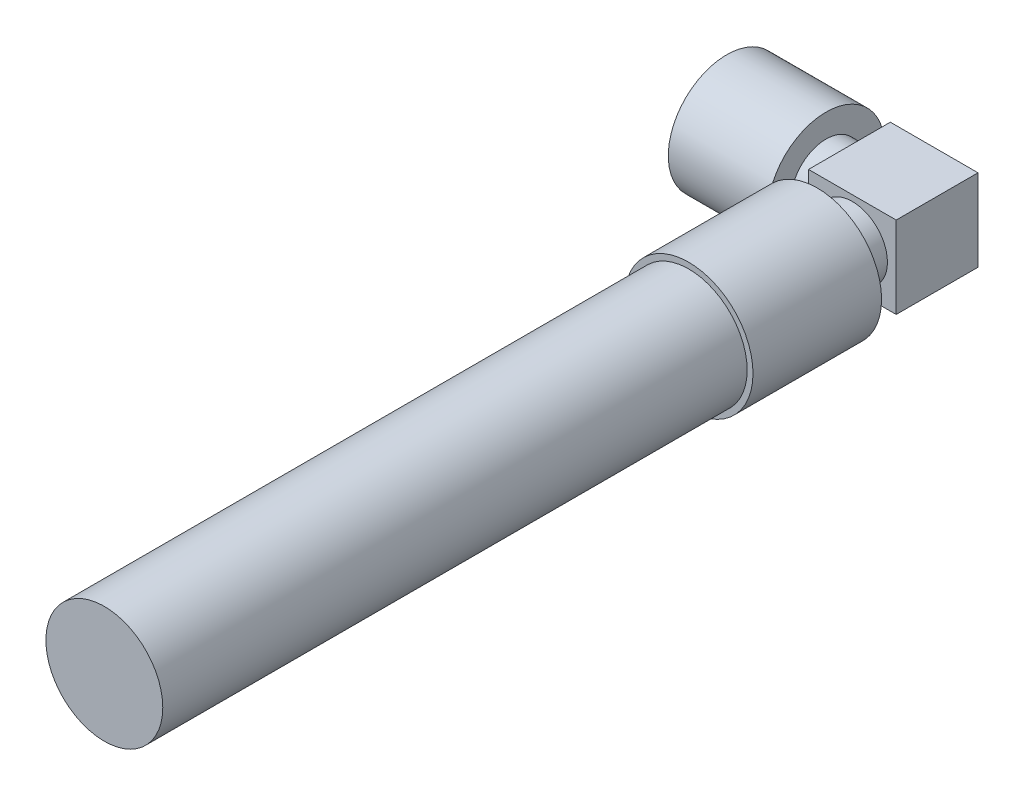
ISO-10303-21;
HEADER;
FILE_DESCRIPTION(('STEP AP214'),'2;1');
FILE_NAME('part.step','',(''),(''),'','','');
FILE_SCHEMA(('AUTOMOTIVE_DESIGN { 1 0 10303 214 1 1 1 1 }'));
ENDSEC;
DATA;
#1=APPLICATION_CONTEXT('core data for automotive mechanical design processes');
#2=APPLICATION_PROTOCOL_DEFINITION('international standard','automotive_design',2000,#1);
#3=PRODUCT_CONTEXT('',#1,'mechanical');
#4=PRODUCT('Part','Part','',(#3));
#5=PRODUCT_RELATED_PRODUCT_CATEGORY('part','',(#4));
#6=PRODUCT_DEFINITION_FORMATION('','',#4);
#7=PRODUCT_DEFINITION_CONTEXT('part definition',#1,'design');
#8=PRODUCT_DEFINITION('design','',#6,#7);
#9=PRODUCT_DEFINITION_SHAPE('','',#8);
#10=(LENGTH_UNIT() NAMED_UNIT(*) SI_UNIT(.MILLI.,.METRE.));
#11=(NAMED_UNIT(*) PLANE_ANGLE_UNIT() SI_UNIT($,.RADIAN.));
#12=(NAMED_UNIT(*) SI_UNIT($,.STERADIAN.) SOLID_ANGLE_UNIT());
#13=UNCERTAINTY_MEASURE_WITH_UNIT(LENGTH_MEASURE(1.E-05),#10,'distance_accuracy_value','');
#14=(GEOMETRIC_REPRESENTATION_CONTEXT(3) GLOBAL_UNCERTAINTY_ASSIGNED_CONTEXT((#13)) GLOBAL_UNIT_ASSIGNED_CONTEXT((#10,
#11,#12)) REPRESENTATION_CONTEXT('',''));
#15=CARTESIAN_POINT('',(0.,0.,0.));
#16=DIRECTION('',(0.,0.,1.));
#17=DIRECTION('',(1.,0.,0.));
#18=AXIS2_PLACEMENT_3D('',#15,#16,#17);
#19=CARTESIAN_POINT('',(-8.5,0.,0.));
#20=DIRECTION('',(1.,0.,0.));
#21=DIRECTION('',(0.,0.,-1.));
#22=AXIS2_PLACEMENT_3D('',#19,#20,#21);
#23=CYLINDRICAL_SURFACE('',#22,5.);
#24=CARTESIAN_POINT('',(-8.5,0.,0.));
#25=DIRECTION('',(1.,0.,0.));
#26=DIRECTION('',(0.,0.,-1.));
#27=AXIS2_PLACEMENT_3D('',#24,#25,#26);
#28=CIRCLE('',#27,5.);
#29=CARTESIAN_POINT('',(-8.5,0.,-5.));
#30=VERTEX_POINT('',#29);
#31=EDGE_CURVE('E116',#30,#30,#28,.T.);
#32=ORIENTED_EDGE('',*,*,#31,.T.);
#33=EDGE_LOOP('',(#32));
#34=FACE_BOUND('',#33,.T.);
#35=CARTESIAN_POINT('',(0.,0.,0.));
#36=DIRECTION('',(1.,0.,0.));
#37=DIRECTION('',(0.,0.,-1.));
#38=AXIS2_PLACEMENT_3D('',#35,#36,#37);
#39=CIRCLE('',#38,5.);
#40=CARTESIAN_POINT('',(0.,0.,-5.));
#41=VERTEX_POINT('',#40);
#42=EDGE_CURVE('E35',#41,#41,#39,.T.);
#43=ORIENTED_EDGE('',*,*,#42,.F.);
#44=EDGE_LOOP('',(#43));
#45=FACE_BOUND('',#44,.T.);
#46=ADVANCED_FACE('F32',(#34,#45),#23,.T.);
#47=CARTESIAN_POINT('',(-8.5,0.,0.));
#48=DIRECTION('',(1.,0.,0.));
#49=DIRECTION('',(0.,0.,-1.));
#50=AXIS2_PLACEMENT_3D('',#47,#48,#49);
#51=PLANE('',#50);
#52=ORIENTED_EDGE('',*,*,#31,.F.);
#53=EDGE_LOOP('',(#52));
#54=FACE_BOUND('',#53,.T.);
#55=ADVANCED_FACE('F126',(#54),#51,.F.);
#56=CARTESIAN_POINT('',(0.,0.,0.));
#57=DIRECTION('',(1.,0.,0.));
#58=DIRECTION('',(0.,0.,-1.));
#59=AXIS2_PLACEMENT_3D('',#56,#57,#58);
#60=PLANE('',#59);
#61=CARTESIAN_POINT('',(0.,0.,0.));
#62=DIRECTION('',(1.,0.,0.));
#63=DIRECTION('',(0.,0.,-1.));
#64=AXIS2_PLACEMENT_3D('',#61,#62,#63);
#65=CIRCLE('',#64,3.);
#66=CARTESIAN_POINT('',(0.,0.,-3.));
#67=VERTEX_POINT('',#66);
#68=EDGE_CURVE('E114',#67,#67,#65,.T.);
#69=ORIENTED_EDGE('',*,*,#68,.F.);
#70=EDGE_LOOP('',(#69));
#71=FACE_BOUND('',#70,.T.);
#72=ORIENTED_EDGE('',*,*,#42,.T.);
#73=EDGE_LOOP('',(#72));
#74=FACE_BOUND('',#73,.T.);
#75=ADVANCED_FACE('F123',(#71,#74),#60,.T.);
#76=CARTESIAN_POINT('',(2.,0.,0.));
#77=DIRECTION('',(-1.,0.,0.));
#78=DIRECTION('',(0.,0.,1.));
#79=AXIS2_PLACEMENT_3D('',#76,#77,#78);
#80=CYLINDRICAL_SURFACE('',#79,3.);
#81=CARTESIAN_POINT('',(2.,0.,0.));
#82=DIRECTION('',(1.,0.,0.));
#83=DIRECTION('',(0.,0.,-1.));
#84=AXIS2_PLACEMENT_3D('',#81,#82,#83);
#85=CIRCLE('',#84,3.);
#86=CARTESIAN_POINT('',(2.,0.,-3.));
#87=VERTEX_POINT('',#86);
#88=EDGE_CURVE('E111',#87,#87,#85,.T.);
#89=ORIENTED_EDGE('',*,*,#88,.F.);
#90=EDGE_LOOP('',(#89));
#91=FACE_BOUND('',#90,.T.);
#92=ORIENTED_EDGE('',*,*,#68,.T.);
#93=EDGE_LOOP('',(#92));
#94=FACE_BOUND('',#93,.T.);
#95=ADVANCED_FACE('F135',(#91,#94),#80,.T.);
#96=CARTESIAN_POINT('',(9.5,3.5,-3.5));
#97=DIRECTION('',(0.,0.,1.));
#98=DIRECTION('',(0.,-1.,0.));
#99=AXIS2_PLACEMENT_3D('',#96,#97,#98);
#100=PLANE('',#99);
#101=DIRECTION('',(0.,1.,0.));
#102=VECTOR('',#101,1.);
#103=CARTESIAN_POINT('',(2.,3.5,-3.5));
#104=LINE('',#103,#102);
#105=CARTESIAN_POINT('',(2.,-3.5,-3.5));
#106=VERTEX_POINT('',#105);
#107=CARTESIAN_POINT('',(2.,3.5,-3.5));
#108=VERTEX_POINT('',#107);
#109=EDGE_CURVE('E101',#106,#108,#104,.T.);
#110=ORIENTED_EDGE('',*,*,#109,.T.);
#111=DIRECTION('',(-1.,0.,0.));
#112=VECTOR('',#111,1.);
#113=CARTESIAN_POINT('',(9.5,3.5,-3.5));
#114=LINE('',#113,#112);
#115=CARTESIAN_POINT('',(9.5,3.5,-3.5));
#116=VERTEX_POINT('',#115);
#117=EDGE_CURVE('E92',#116,#108,#114,.T.);
#118=ORIENTED_EDGE('',*,*,#117,.F.);
#119=DIRECTION('',(0.,1.,0.));
#120=VECTOR('',#119,1.);
#121=CARTESIAN_POINT('',(9.5,3.5,-3.5));
#122=LINE('',#121,#120);
#123=CARTESIAN_POINT('',(9.5,-3.5,-3.5));
#124=VERTEX_POINT('',#123);
#125=EDGE_CURVE('E86',#124,#116,#122,.T.);
#126=ORIENTED_EDGE('',*,*,#125,.F.);
#127=DIRECTION('',(-1.,0.,0.));
#128=VECTOR('',#127,1.);
#129=CARTESIAN_POINT('',(9.5,-3.5,-3.5));
#130=LINE('',#129,#128);
#131=EDGE_CURVE('E97',#124,#106,#130,.T.);
#132=ORIENTED_EDGE('',*,*,#131,.T.);
#133=EDGE_LOOP('',(#110,#118,#126,#132));
#134=FACE_BOUND('',#133,.T.);
#135=ADVANCED_FACE('F140',(#134),#100,.F.);
#136=CARTESIAN_POINT('',(9.5,3.5,3.5));
#137=DIRECTION('',(0.,-1.,0.));
#138=DIRECTION('',(0.,0.,-1.));
#139=AXIS2_PLACEMENT_3D('',#136,#137,#138);
#140=PLANE('',#139);
#141=DIRECTION('',(0.,0.,1.));
#142=VECTOR('',#141,1.);
#143=CARTESIAN_POINT('',(2.,3.5,3.5));
#144=LINE('',#143,#142);
#145=CARTESIAN_POINT('',(2.,3.5,3.5));
#146=VERTEX_POINT('',#145);
#147=EDGE_CURVE('E91',#108,#146,#144,.T.);
#148=ORIENTED_EDGE('',*,*,#147,.T.);
#149=DIRECTION('',(-1.,0.,0.));
#150=VECTOR('',#149,1.);
#151=CARTESIAN_POINT('',(9.5,3.5,3.5));
#152=LINE('',#151,#150);
#153=CARTESIAN_POINT('',(9.5,3.5,3.5));
#154=VERTEX_POINT('',#153);
#155=EDGE_CURVE('E89',#154,#146,#152,.T.);
#156=ORIENTED_EDGE('',*,*,#155,.F.);
#157=DIRECTION('',(0.,0.,1.));
#158=VECTOR('',#157,1.);
#159=CARTESIAN_POINT('',(9.5,3.5,3.5));
#160=LINE('',#159,#158);
#161=EDGE_CURVE('E81',#116,#154,#160,.T.);
#162=ORIENTED_EDGE('',*,*,#161,.F.);
#163=ORIENTED_EDGE('',*,*,#117,.T.);
#164=EDGE_LOOP('',(#148,#156,#162,#163));
#165=FACE_BOUND('',#164,.T.);
#166=ADVANCED_FACE('F90',(#165),#140,.F.);
#167=CARTESIAN_POINT('',(9.5,3.5,3.5));
#168=DIRECTION('',(0.,0.,-1.));
#169=DIRECTION('',(0.,1.,0.));
#170=AXIS2_PLACEMENT_3D('',#167,#168,#169);
#171=PLANE('',#170);
#172=CARTESIAN_POINT('',(5.75,0.,3.5));
#173=DIRECTION('',(0.,0.,1.));
#174=DIRECTION('',(1.,0.,0.));
#175=AXIS2_PLACEMENT_3D('',#172,#173,#174);
#176=CIRCLE('',#175,3.);
#177=CARTESIAN_POINT('',(8.75,0.,3.5));
#178=VERTEX_POINT('',#177);
#179=EDGE_CURVE('E41',#178,#178,#176,.T.);
#180=ORIENTED_EDGE('',*,*,#179,.F.);
#181=EDGE_LOOP('',(#180));
#182=FACE_BOUND('',#181,.T.);
#183=DIRECTION('',(0.,-1.,0.));
#184=VECTOR('',#183,1.);
#185=CARTESIAN_POINT('',(2.,3.5,3.5));
#186=LINE('',#185,#184);
#187=CARTESIAN_POINT('',(2.,-3.5,3.5));
#188=VERTEX_POINT('',#187);
#189=EDGE_CURVE('E67',#146,#188,#186,.T.);
#190=ORIENTED_EDGE('',*,*,#189,.T.);
#191=DIRECTION('',(-1.,0.,0.));
#192=VECTOR('',#191,1.);
#193=CARTESIAN_POINT('',(9.5,-3.5,3.5));
#194=LINE('',#193,#192);
#195=CARTESIAN_POINT('',(9.5,-3.5,3.5));
#196=VERTEX_POINT('',#195);
#197=EDGE_CURVE('E93',#196,#188,#194,.T.);
#198=ORIENTED_EDGE('',*,*,#197,.F.);
#199=DIRECTION('',(0.,-1.,0.));
#200=VECTOR('',#199,1.);
#201=CARTESIAN_POINT('',(9.5,3.5,3.5));
#202=LINE('',#201,#200);
#203=EDGE_CURVE('E84',#154,#196,#202,.T.);
#204=ORIENTED_EDGE('',*,*,#203,.F.);
#205=ORIENTED_EDGE('',*,*,#155,.T.);
#206=EDGE_LOOP('',(#190,#198,#204,#205));
#207=FACE_BOUND('',#206,.T.);
#208=ADVANCED_FACE('F95',(#182,#207),#171,.F.);
#209=CARTESIAN_POINT('',(9.5,-3.5,3.5));
#210=DIRECTION('',(0.,1.,0.));
#211=DIRECTION('',(0.,0.,1.));
#212=AXIS2_PLACEMENT_3D('',#209,#210,#211);
#213=PLANE('',#212);
#214=DIRECTION('',(0.,0.,-1.));
#215=VECTOR('',#214,1.);
#216=CARTESIAN_POINT('',(2.,-3.5,3.5));
#217=LINE('',#216,#215);
#218=EDGE_CURVE('E73',#188,#106,#217,.T.);
#219=ORIENTED_EDGE('',*,*,#218,.T.);
#220=ORIENTED_EDGE('',*,*,#131,.F.);
#221=DIRECTION('',(0.,0.,-1.));
#222=VECTOR('',#221,1.);
#223=CARTESIAN_POINT('',(9.5,-3.5,3.5));
#224=LINE('',#223,#222);
#225=EDGE_CURVE('E50',#196,#124,#224,.T.);
#226=ORIENTED_EDGE('',*,*,#225,.F.);
#227=ORIENTED_EDGE('',*,*,#197,.T.);
#228=EDGE_LOOP('',(#219,#220,#226,#227));
#229=FACE_BOUND('',#228,.T.);
#230=ADVANCED_FACE('F149',(#229),#213,.F.);
#231=CARTESIAN_POINT('',(9.5,0.,0.));
#232=DIRECTION('',(1.,0.,0.));
#233=DIRECTION('',(0.,0.,-1.));
#234=AXIS2_PLACEMENT_3D('',#231,#232,#233);
#235=PLANE('',#234);
#236=ORIENTED_EDGE('',*,*,#125,.T.);
#237=ORIENTED_EDGE('',*,*,#161,.T.);
#238=ORIENTED_EDGE('',*,*,#203,.T.);
#239=ORIENTED_EDGE('',*,*,#225,.T.);
#240=EDGE_LOOP('',(#236,#237,#238,#239));
#241=FACE_BOUND('',#240,.T.);
#242=ADVANCED_FACE('F82',(#241),#235,.T.);
#243=CARTESIAN_POINT('',(2.,0.,0.));
#244=DIRECTION('',(1.,0.,0.));
#245=DIRECTION('',(0.,0.,-1.));
#246=AXIS2_PLACEMENT_3D('',#243,#244,#245);
#247=PLANE('',#246);
#248=ORIENTED_EDGE('',*,*,#88,.T.);
#249=EDGE_LOOP('',(#248));
#250=FACE_BOUND('',#249,.T.);
#251=ORIENTED_EDGE('',*,*,#109,.F.);
#252=ORIENTED_EDGE('',*,*,#218,.F.);
#253=ORIENTED_EDGE('',*,*,#189,.F.);
#254=ORIENTED_EDGE('',*,*,#147,.F.);
#255=EDGE_LOOP('',(#251,#252,#253,#254));
#256=FACE_BOUND('',#255,.T.);
#257=ADVANCED_FACE('F153',(#250,#256),#247,.F.);
#258=CARTESIAN_POINT('',(5.75,0.,6.5));
#259=DIRECTION('',(0.,0.,-1.));
#260=DIRECTION('',(-1.,0.,0.));
#261=AXIS2_PLACEMENT_3D('',#258,#259,#260);
#262=CYLINDRICAL_SURFACE('',#261,3.);
#263=CARTESIAN_POINT('',(5.75,0.,6.5));
#264=DIRECTION('',(0.,0.,1.));
#265=DIRECTION('',(1.,0.,0.));
#266=AXIS2_PLACEMENT_3D('',#263,#264,#265);
#267=CIRCLE('',#266,3.);
#268=CARTESIAN_POINT('',(8.75,0.,6.5));
#269=VERTEX_POINT('',#268);
#270=EDGE_CURVE('E104',#269,#269,#267,.T.);
#271=ORIENTED_EDGE('',*,*,#270,.F.);
#272=EDGE_LOOP('',(#271));
#273=FACE_BOUND('',#272,.T.);
#274=ORIENTED_EDGE('',*,*,#179,.T.);
#275=EDGE_LOOP('',(#274));
#276=FACE_BOUND('',#275,.T.);
#277=ADVANCED_FACE('F156',(#273,#276),#262,.T.);
#278=CARTESIAN_POINT('',(5.75,0.,17.5));
#279=DIRECTION('',(0.,0.,-1.));
#280=DIRECTION('',(-1.,0.,0.));
#281=AXIS2_PLACEMENT_3D('',#278,#279,#280);
#282=CYLINDRICAL_SURFACE('',#281,5.5);
#283=CARTESIAN_POINT('',(5.75,0.,17.5));
#284=DIRECTION('',(0.,0.,1.));
#285=DIRECTION('',(1.,0.,0.));
#286=AXIS2_PLACEMENT_3D('',#283,#284,#285);
#287=CIRCLE('',#286,5.5);
#288=CARTESIAN_POINT('',(11.25,0.,17.5));
#289=VERTEX_POINT('',#288);
#290=EDGE_CURVE('E190',#289,#289,#287,.T.);
#291=ORIENTED_EDGE('',*,*,#290,.F.);
#292=EDGE_LOOP('',(#291));
#293=FACE_BOUND('',#292,.T.);
#294=CARTESIAN_POINT('',(5.75,0.,6.5));
#295=DIRECTION('',(0.,0.,1.));
#296=DIRECTION('',(1.,0.,0.));
#297=AXIS2_PLACEMENT_3D('',#294,#295,#296);
#298=CIRCLE('',#297,5.5);
#299=CARTESIAN_POINT('',(11.25,0.,6.5));
#300=VERTEX_POINT('',#299);
#301=EDGE_CURVE('E187',#300,#300,#298,.T.);
#302=ORIENTED_EDGE('',*,*,#301,.T.);
#303=EDGE_LOOP('',(#302));
#304=FACE_BOUND('',#303,.T.);
#305=ADVANCED_FACE('F162',(#293,#304),#282,.T.);
#306=CARTESIAN_POINT('',(5.75,0.,17.5));
#307=DIRECTION('',(0.,0.,1.));
#308=DIRECTION('',(1.,0.,0.));
#309=AXIS2_PLACEMENT_3D('',#306,#307,#308);
#310=PLANE('',#309);
#311=CARTESIAN_POINT('',(5.75,0.,17.5));
#312=DIRECTION('',(0.,0.,1.));
#313=DIRECTION('',(1.,0.,0.));
#314=AXIS2_PLACEMENT_3D('',#311,#312,#313);
#315=CIRCLE('',#314,5.);
#316=CARTESIAN_POINT('',(10.75,0.,17.5));
#317=VERTEX_POINT('',#316);
#318=EDGE_CURVE('E11',#317,#317,#315,.T.);
#319=ORIENTED_EDGE('',*,*,#318,.F.);
#320=EDGE_LOOP('',(#319));
#321=FACE_BOUND('',#320,.T.);
#322=ORIENTED_EDGE('',*,*,#290,.T.);
#323=EDGE_LOOP('',(#322));
#324=FACE_BOUND('',#323,.T.);
#325=ADVANCED_FACE('F166',(#321,#324),#310,.T.);
#326=CARTESIAN_POINT('',(5.75,0.,6.5));
#327=DIRECTION('',(0.,0.,1.));
#328=DIRECTION('',(1.,0.,0.));
#329=AXIS2_PLACEMENT_3D('',#326,#327,#328);
#330=PLANE('',#329);
#331=ORIENTED_EDGE('',*,*,#270,.T.);
#332=EDGE_LOOP('',(#331));
#333=FACE_BOUND('',#332,.T.);
#334=ORIENTED_EDGE('',*,*,#301,.F.);
#335=EDGE_LOOP('',(#334));
#336=FACE_BOUND('',#335,.T.);
#337=ADVANCED_FACE('F168',(#333,#336),#330,.F.);
#338=CARTESIAN_POINT('',(5.75,0.,67.5));
#339=DIRECTION('',(0.,0.,-1.));
#340=DIRECTION('',(-1.,0.,0.));
#341=AXIS2_PLACEMENT_3D('',#338,#339,#340);
#342=CYLINDRICAL_SURFACE('',#341,5.);
#343=CARTESIAN_POINT('',(5.75,0.,67.5));
#344=DIRECTION('',(0.,0.,1.));
#345=DIRECTION('',(1.,0.,0.));
#346=AXIS2_PLACEMENT_3D('',#343,#344,#345);
#347=CIRCLE('',#346,5.);
#348=CARTESIAN_POINT('',(10.75,0.,67.5));
#349=VERTEX_POINT('',#348);
#350=EDGE_CURVE('E186',#349,#349,#347,.T.);
#351=ORIENTED_EDGE('',*,*,#350,.F.);
#352=EDGE_LOOP('',(#351));
#353=FACE_BOUND('',#352,.T.);
#354=ORIENTED_EDGE('',*,*,#318,.T.);
#355=EDGE_LOOP('',(#354));
#356=FACE_BOUND('',#355,.T.);
#357=ADVANCED_FACE('F171',(#353,#356),#342,.T.);
#358=CARTESIAN_POINT('',(5.75,0.,67.5));
#359=DIRECTION('',(0.,0.,1.));
#360=DIRECTION('',(1.,0.,0.));
#361=AXIS2_PLACEMENT_3D('',#358,#359,#360);
#362=PLANE('',#361);
#363=ORIENTED_EDGE('',*,*,#350,.T.);
#364=EDGE_LOOP('',(#363));
#365=FACE_BOUND('',#364,.T.);
#366=ADVANCED_FACE('F178',(#365),#362,.T.);
#367=CLOSED_SHELL('',(#46,#55,#75,#95,#135,#166,#208,#230,#242,#257,#277,#305,#325,#337,#357,#366));
#368=MANIFOLD_SOLID_BREP('B2',#367);
#369=ADVANCED_BREP_SHAPE_REPRESENTATION('',(#18,#368),#14);
#370=SHAPE_DEFINITION_REPRESENTATION(#9,#369);
ENDSEC;
END-ISO-10303-21;
